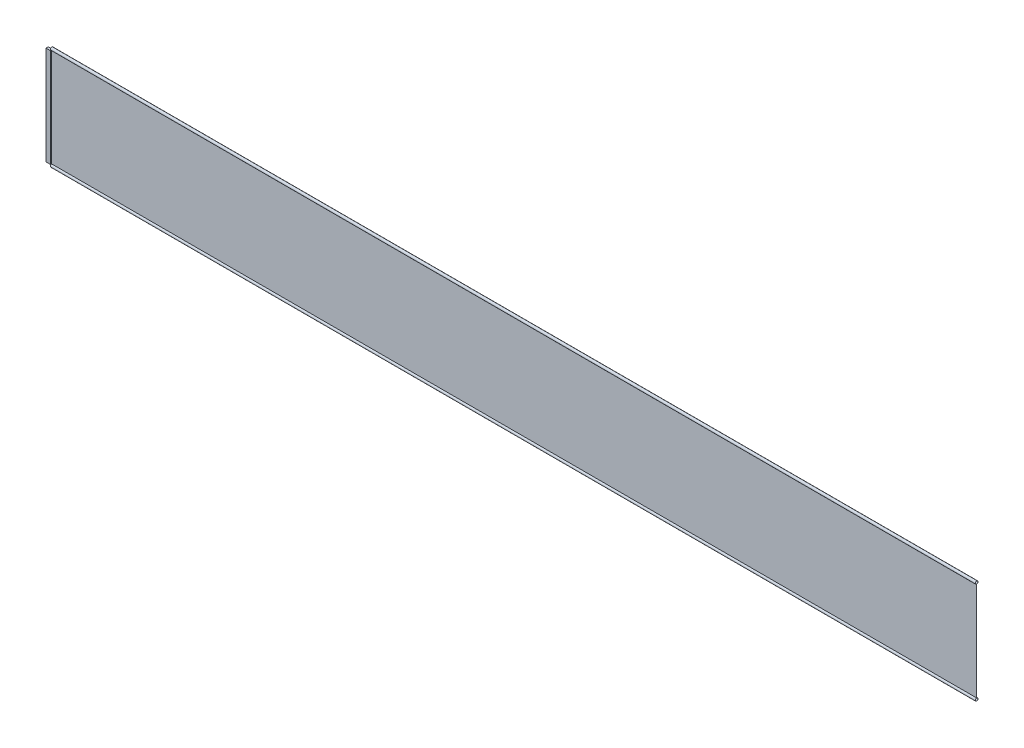
ISO-10303-21;
HEADER;
FILE_DESCRIPTION(('STEP AP214'),'2;1');
FILE_NAME('part.step','',(''),(''),'','','');
FILE_SCHEMA(('AUTOMOTIVE_DESIGN { 1 0 10303 214 1 1 1 1 }'));
ENDSEC;
DATA;
#1=APPLICATION_CONTEXT('core data for automotive mechanical design processes');
#2=APPLICATION_PROTOCOL_DEFINITION('international standard','automotive_design',2000,#1);
#3=PRODUCT_CONTEXT('',#1,'mechanical');
#4=PRODUCT('Part','Part','',(#3));
#5=PRODUCT_RELATED_PRODUCT_CATEGORY('part','',(#4));
#6=PRODUCT_DEFINITION_FORMATION('','',#4);
#7=PRODUCT_DEFINITION_CONTEXT('part definition',#1,'design');
#8=PRODUCT_DEFINITION('design','',#6,#7);
#9=PRODUCT_DEFINITION_SHAPE('','',#8);
#10=(LENGTH_UNIT() NAMED_UNIT(*) SI_UNIT(.MILLI.,.METRE.));
#11=(NAMED_UNIT(*) PLANE_ANGLE_UNIT() SI_UNIT($,.RADIAN.));
#12=(NAMED_UNIT(*) SI_UNIT($,.STERADIAN.) SOLID_ANGLE_UNIT());
#13=UNCERTAINTY_MEASURE_WITH_UNIT(LENGTH_MEASURE(1.E-05),#10,'distance_accuracy_value','');
#14=(GEOMETRIC_REPRESENTATION_CONTEXT(3) GLOBAL_UNCERTAINTY_ASSIGNED_CONTEXT((#13)) GLOBAL_UNIT_ASSIGNED_CONTEXT((#10,
#11,#12)) REPRESENTATION_CONTEXT('',''));
#15=CARTESIAN_POINT('',(0.,0.,0.));
#16=DIRECTION('',(0.,0.,1.));
#17=DIRECTION('',(1.,0.,0.));
#18=AXIS2_PLACEMENT_3D('',#15,#16,#17);
#19=CARTESIAN_POINT('',(43749.6261893495,2210.,0.));
#20=DIRECTION('',(1.,0.,0.));
#21=DIRECTION('',(0.,0.,-1.));
#22=AXIS2_PLACEMENT_3D('',#19,#20,#21);
#23=PLANE('',#22);
#24=CARTESIAN_POINT('',(43749.6261893495,2210.,0.));
#25=DIRECTION('',(1.,0.,0.));
#26=DIRECTION('',(0.,0.,-1.));
#27=AXIS2_PLACEMENT_3D('',#24,#25,#26);
#28=CIRCLE('',#27,60.);
#29=CARTESIAN_POINT('',(43749.6261893495,2210.,-60.));
#30=VERTEX_POINT('',#29);
#31=EDGE_CURVE('E11',#30,#30,#28,.T.);
#32=ORIENTED_EDGE('',*,*,#31,.T.);
#33=EDGE_LOOP('',(#32));
#34=FACE_BOUND('',#33,.T.);
#35=CARTESIAN_POINT('',(43749.6261893495,2210.,0.));
#36=DIRECTION('',(1.,0.,0.));
#37=DIRECTION('',(0.,0.,-1.));
#38=AXIS2_PLACEMENT_3D('',#35,#36,#37);
#39=CIRCLE('',#38,57.);
#40=CARTESIAN_POINT('',(43749.6261893495,2210.,-57.));
#41=VERTEX_POINT('',#40);
#42=EDGE_CURVE('E60',#41,#41,#39,.T.);
#43=ORIENTED_EDGE('',*,*,#42,.F.);
#44=EDGE_LOOP('',(#43));
#45=FACE_BOUND('',#44,.T.);
#46=ADVANCED_FACE('F46',(#34,#45),#23,.T.);
#47=CARTESIAN_POINT('',(3400.,2210.,0.));
#48=DIRECTION('',(1.,0.,0.));
#49=DIRECTION('',(0.,0.,-1.));
#50=AXIS2_PLACEMENT_3D('',#47,#48,#49);
#51=PLANE('',#50);
#52=CARTESIAN_POINT('',(3400.,2210.,0.));
#53=DIRECTION('',(1.,0.,0.));
#54=DIRECTION('',(0.,0.,-1.));
#55=AXIS2_PLACEMENT_3D('',#52,#53,#54);
#56=CIRCLE('',#55,60.);
#57=CARTESIAN_POINT('',(3400.,2210.,-60.));
#58=VERTEX_POINT('',#57);
#59=EDGE_CURVE('E49',#58,#58,#56,.T.);
#60=ORIENTED_EDGE('',*,*,#59,.F.);
#61=EDGE_LOOP('',(#60));
#62=FACE_BOUND('',#61,.T.);
#63=CARTESIAN_POINT('',(3400.,2210.,0.));
#64=DIRECTION('',(1.,0.,0.));
#65=DIRECTION('',(0.,0.,-1.));
#66=AXIS2_PLACEMENT_3D('',#63,#64,#65);
#67=CIRCLE('',#66,57.);
#68=CARTESIAN_POINT('',(3400.,2210.,-57.));
#69=VERTEX_POINT('',#68);
#70=EDGE_CURVE('E56',#69,#69,#67,.T.);
#71=ORIENTED_EDGE('',*,*,#70,.T.);
#72=EDGE_LOOP('',(#71));
#73=FACE_BOUND('',#72,.T.);
#74=ADVANCED_FACE('F66',(#62,#73),#51,.F.);
#75=CARTESIAN_POINT('',(43749.6261893495,2210.,0.));
#76=DIRECTION('',(-1.,0.,0.));
#77=DIRECTION('',(0.,0.,1.));
#78=AXIS2_PLACEMENT_3D('',#75,#76,#77);
#79=CYLINDRICAL_SURFACE('',#78,60.);
#80=ORIENTED_EDGE('',*,*,#31,.F.);
#81=EDGE_LOOP('',(#80));
#82=FACE_BOUND('',#81,.T.);
#83=ORIENTED_EDGE('',*,*,#59,.T.);
#84=EDGE_LOOP('',(#83));
#85=FACE_BOUND('',#84,.T.);
#86=ADVANCED_FACE('F48',(#82,#85),#79,.T.);
#87=CARTESIAN_POINT('',(43749.6261893495,2210.,0.));
#88=DIRECTION('',(-1.,0.,0.));
#89=DIRECTION('',(0.,0.,1.));
#90=AXIS2_PLACEMENT_3D('',#87,#88,#89);
#91=CYLINDRICAL_SURFACE('',#90,57.);
#92=ORIENTED_EDGE('',*,*,#42,.T.);
#93=EDGE_LOOP('',(#92));
#94=FACE_BOUND('',#93,.T.);
#95=ORIENTED_EDGE('',*,*,#70,.F.);
#96=EDGE_LOOP('',(#95));
#97=FACE_BOUND('',#96,.T.);
#98=ADVANCED_FACE('F61',(#94,#97),#91,.F.);
#99=CLOSED_SHELL('',(#46,#74,#86,#98));
#100=MANIFOLD_SOLID_BREP('B2',#99);
#101=CARTESIAN_POINT('',(43749.6261893495,-2210.,0.));
#102=DIRECTION('',(1.,0.,0.));
#103=DIRECTION('',(0.,0.,-1.));
#104=AXIS2_PLACEMENT_3D('',#101,#102,#103);
#105=PLANE('',#104);
#106=CARTESIAN_POINT('',(43749.6261893495,-2210.,0.));
#107=DIRECTION('',(1.,0.,0.));
#108=DIRECTION('',(0.,0.,-1.));
#109=AXIS2_PLACEMENT_3D('',#106,#107,#108);
#110=CIRCLE('',#109,60.);
#111=CARTESIAN_POINT('',(43749.6261893495,-2210.,-60.));
#112=VERTEX_POINT('',#111);
#113=EDGE_CURVE('E44',#112,#112,#110,.T.);
#114=ORIENTED_EDGE('',*,*,#113,.T.);
#115=EDGE_LOOP('',(#114));
#116=FACE_BOUND('',#115,.T.);
#117=CARTESIAN_POINT('',(43749.6261893495,-2210.,0.));
#118=DIRECTION('',(1.,0.,0.));
#119=DIRECTION('',(0.,0.,-1.));
#120=AXIS2_PLACEMENT_3D('',#117,#118,#119);
#121=CIRCLE('',#120,57.);
#122=CARTESIAN_POINT('',(43749.6261893495,-2210.,-57.));
#123=VERTEX_POINT('',#122);
#124=EDGE_CURVE('E126',#123,#123,#121,.T.);
#125=ORIENTED_EDGE('',*,*,#124,.F.);
#126=EDGE_LOOP('',(#125));
#127=FACE_BOUND('',#126,.T.);
#128=ADVANCED_FACE('F119',(#116,#127),#105,.T.);
#129=CARTESIAN_POINT('',(3400.,-2210.,0.));
#130=DIRECTION('',(1.,0.,0.));
#131=DIRECTION('',(0.,0.,-1.));
#132=AXIS2_PLACEMENT_3D('',#129,#130,#131);
#133=PLANE('',#132);
#134=CARTESIAN_POINT('',(3400.,-2210.,0.));
#135=DIRECTION('',(1.,0.,0.));
#136=DIRECTION('',(0.,0.,-1.));
#137=AXIS2_PLACEMENT_3D('',#134,#135,#136);
#138=CIRCLE('',#137,60.);
#139=CARTESIAN_POINT('',(3400.,-2210.,-60.));
#140=VERTEX_POINT('',#139);
#141=EDGE_CURVE('E122',#140,#140,#138,.T.);
#142=ORIENTED_EDGE('',*,*,#141,.F.);
#143=EDGE_LOOP('',(#142));
#144=FACE_BOUND('',#143,.T.);
#145=CARTESIAN_POINT('',(3400.,-2210.,0.));
#146=DIRECTION('',(1.,0.,0.));
#147=DIRECTION('',(0.,0.,-1.));
#148=AXIS2_PLACEMENT_3D('',#145,#146,#147);
#149=CIRCLE('',#148,57.);
#150=CARTESIAN_POINT('',(3400.,-2210.,-57.));
#151=VERTEX_POINT('',#150);
#152=EDGE_CURVE('E128',#151,#151,#149,.T.);
#153=ORIENTED_EDGE('',*,*,#152,.T.);
#154=EDGE_LOOP('',(#153));
#155=FACE_BOUND('',#154,.T.);
#156=ADVANCED_FACE('F138',(#144,#155),#133,.F.);
#157=CARTESIAN_POINT('',(43749.6261893495,-2210.,0.));
#158=DIRECTION('',(-1.,0.,0.));
#159=DIRECTION('',(0.,0.,1.));
#160=AXIS2_PLACEMENT_3D('',#157,#158,#159);
#161=CYLINDRICAL_SURFACE('',#160,60.);
#162=ORIENTED_EDGE('',*,*,#113,.F.);
#163=EDGE_LOOP('',(#162));
#164=FACE_BOUND('',#163,.T.);
#165=ORIENTED_EDGE('',*,*,#141,.T.);
#166=EDGE_LOOP('',(#165));
#167=FACE_BOUND('',#166,.T.);
#168=ADVANCED_FACE('F120',(#164,#167),#161,.T.);
#169=CARTESIAN_POINT('',(43749.6261893495,-2210.,0.));
#170=DIRECTION('',(-1.,0.,0.));
#171=DIRECTION('',(0.,0.,1.));
#172=AXIS2_PLACEMENT_3D('',#169,#170,#171);
#173=CYLINDRICAL_SURFACE('',#172,57.);
#174=ORIENTED_EDGE('',*,*,#124,.T.);
#175=EDGE_LOOP('',(#174));
#176=FACE_BOUND('',#175,.T.);
#177=ORIENTED_EDGE('',*,*,#152,.F.);
#178=EDGE_LOOP('',(#177));
#179=FACE_BOUND('',#178,.T.);
#180=ADVANCED_FACE('F137',(#176,#179),#173,.F.);
#181=CLOSED_SHELL('',(#128,#156,#168,#180));
#182=MANIFOLD_SOLID_BREP('B6',#181);
#183=CARTESIAN_POINT('',(3400.,-2150.,50.));
#184=DIRECTION('',(-1.,0.,0.));
#185=DIRECTION('',(0.,0.,1.));
#186=AXIS2_PLACEMENT_3D('',#183,#184,#185);
#187=PLANE('',#186);
#188=DIRECTION('',(0.,-1.,0.));
#189=VECTOR('',#188,1.);
#190=CARTESIAN_POINT('',(3400.,-2150.,1.5));
#191=LINE('',#190,#189);
#192=CARTESIAN_POINT('',(3400.,2150.,1.5));
#193=VERTEX_POINT('',#192);
#194=CARTESIAN_POINT('',(3400.,-2150.,1.5));
#195=VERTEX_POINT('',#194);
#196=EDGE_CURVE('E247',#193,#195,#191,.T.);
#197=ORIENTED_EDGE('',*,*,#196,.F.);
#198=DIRECTION('',(0.,0.,-1.));
#199=VECTOR('',#198,1.);
#200=CARTESIAN_POINT('',(3400.,2150.,50.));
#201=LINE('',#200,#199);
#202=CARTESIAN_POINT('',(3400.,2150.,50.));
#203=VERTEX_POINT('',#202);
#204=EDGE_CURVE('E296',#203,#193,#201,.T.);
#205=ORIENTED_EDGE('',*,*,#204,.F.);
#206=DIRECTION('',(0.,1.,0.));
#207=VECTOR('',#206,1.);
#208=CARTESIAN_POINT('',(3400.,-2150.,50.));
#209=LINE('',#208,#207);
#210=CARTESIAN_POINT('',(3400.,-2150.,50.));
#211=VERTEX_POINT('',#210);
#212=EDGE_CURVE('E250',#211,#203,#209,.T.);
#213=ORIENTED_EDGE('',*,*,#212,.F.);
#214=DIRECTION('',(0.,0.,-1.));
#215=VECTOR('',#214,1.);
#216=CARTESIAN_POINT('',(3400.,-2150.,50.));
#217=LINE('',#216,#215);
#218=EDGE_CURVE('E189',#211,#195,#217,.T.);
#219=ORIENTED_EDGE('',*,*,#218,.T.);
#220=EDGE_LOOP('',(#197,#205,#213,#219));
#221=FACE_BOUND('',#220,.T.);
#222=ADVANCED_FACE('F176',(#221),#187,.F.);
#223=CARTESIAN_POINT('',(3200.,-2150.,50.));
#224=DIRECTION('',(1.,0.,0.));
#225=DIRECTION('',(0.,0.,-1.));
#226=AXIS2_PLACEMENT_3D('',#223,#224,#225);
#227=PLANE('',#226);
#228=DIRECTION('',(0.,-1.,0.));
#229=VECTOR('',#228,1.);
#230=CARTESIAN_POINT('',(3200.,-2150.,-50.));
#231=LINE('',#230,#229);
#232=CARTESIAN_POINT('',(3200.,2150.,-50.));
#233=VERTEX_POINT('',#232);
#234=CARTESIAN_POINT('',(3200.,-2150.,-50.));
#235=VERTEX_POINT('',#234);
#236=EDGE_CURVE('E276',#233,#235,#231,.T.);
#237=ORIENTED_EDGE('',*,*,#236,.T.);
#238=DIRECTION('',(0.,0.,-1.));
#239=VECTOR('',#238,1.);
#240=CARTESIAN_POINT('',(3200.,-2150.,50.));
#241=LINE('',#240,#239);
#242=CARTESIAN_POINT('',(3200.,-2150.,50.));
#243=VERTEX_POINT('',#242);
#244=EDGE_CURVE('E113',#243,#235,#241,.T.);
#245=ORIENTED_EDGE('',*,*,#244,.F.);
#246=DIRECTION('',(0.,-1.,0.));
#247=VECTOR('',#246,1.);
#248=CARTESIAN_POINT('',(3200.,-2150.,50.));
#249=LINE('',#248,#247);
#250=CARTESIAN_POINT('',(3200.,2150.,50.));
#251=VERTEX_POINT('',#250);
#252=EDGE_CURVE('E278',#251,#243,#249,.T.);
#253=ORIENTED_EDGE('',*,*,#252,.F.);
#254=DIRECTION('',(0.,0.,-1.));
#255=VECTOR('',#254,1.);
#256=CARTESIAN_POINT('',(3200.,2150.,50.));
#257=LINE('',#256,#255);
#258=EDGE_CURVE('E286',#251,#233,#257,.T.);
#259=ORIENTED_EDGE('',*,*,#258,.T.);
#260=EDGE_LOOP('',(#237,#245,#253,#259));
#261=FACE_BOUND('',#260,.T.);
#262=ADVANCED_FACE('F182',(#261),#227,.F.);
#263=CARTESIAN_POINT('',(3200.,-2150.,50.));
#264=DIRECTION('',(0.,1.,0.));
#265=DIRECTION('',(0.,0.,1.));
#266=AXIS2_PLACEMENT_3D('',#263,#264,#265);
#267=PLANE('',#266);
#268=DIRECTION('',(1.,0.,0.));
#269=VECTOR('',#268,1.);
#270=CARTESIAN_POINT('',(3400.,-2150.,-1.5));
#271=LINE('',#270,#269);
#272=CARTESIAN_POINT('',(3400.,-2150.,-1.5));
#273=VERTEX_POINT('',#272);
#274=CARTESIAN_POINT('',(43749.6261893495,-2150.,-1.5));
#275=VERTEX_POINT('',#274);
#276=EDGE_CURVE('E272',#273,#275,#271,.T.);
#277=ORIENTED_EDGE('',*,*,#276,.T.);
#278=DIRECTION('',(0.,0.,-1.));
#279=VECTOR('',#278,1.);
#280=CARTESIAN_POINT('',(43749.6261893495,-2150.,1.5));
#281=LINE('',#280,#279);
#282=CARTESIAN_POINT('',(43749.6261893495,-2150.,1.5));
#283=VERTEX_POINT('',#282);
#284=EDGE_CURVE('E254',#283,#275,#281,.T.);
#285=ORIENTED_EDGE('',*,*,#284,.F.);
#286=DIRECTION('',(1.,0.,0.));
#287=VECTOR('',#286,1.);
#288=CARTESIAN_POINT('',(3400.,-2150.,1.5));
#289=LINE('',#288,#287);
#290=EDGE_CURVE('E252',#195,#283,#289,.T.);
#291=ORIENTED_EDGE('',*,*,#290,.F.);
#292=ORIENTED_EDGE('',*,*,#218,.F.);
#293=DIRECTION('',(1.,0.,0.));
#294=VECTOR('',#293,1.);
#295=CARTESIAN_POINT('',(3200.,-2150.,50.));
#296=LINE('',#295,#294);
#297=EDGE_CURVE('E282',#243,#211,#296,.T.);
#298=ORIENTED_EDGE('',*,*,#297,.F.);
#299=ORIENTED_EDGE('',*,*,#244,.T.);
#300=DIRECTION('',(1.,0.,0.));
#301=VECTOR('',#300,1.);
#302=CARTESIAN_POINT('',(3200.,-2150.,-50.));
#303=LINE('',#302,#301);
#304=CARTESIAN_POINT('',(3400.,-2150.,-50.));
#305=VERTEX_POINT('',#304);
#306=EDGE_CURVE('E295',#235,#305,#303,.T.);
#307=ORIENTED_EDGE('',*,*,#306,.T.);
#308=EDGE_CURVE('E248',#273,#305,#217,.T.);
#309=ORIENTED_EDGE('',*,*,#308,.F.);
#310=EDGE_LOOP('',(#277,#285,#291,#292,#298,#299,#307,#309));
#311=FACE_BOUND('',#310,.T.);
#312=ADVANCED_FACE('F255',(#311),#267,.F.);
#313=CARTESIAN_POINT('',(3400.,2150.,-1.5));
#314=VERTEX_POINT('',#313);
#315=CARTESIAN_POINT('',(3400.,2150.,-50.));
#316=VERTEX_POINT('',#315);
#317=EDGE_CURVE('E200',#314,#316,#201,.T.);
#318=ORIENTED_EDGE('',*,*,#317,.F.);
#319=DIRECTION('',(0.,-1.,0.));
#320=VECTOR('',#319,1.);
#321=CARTESIAN_POINT('',(3400.,-2150.,-1.5));
#322=LINE('',#321,#320);
#323=EDGE_CURVE('E191',#314,#273,#322,.T.);
#324=ORIENTED_EDGE('',*,*,#323,.T.);
#325=ORIENTED_EDGE('',*,*,#308,.T.);
#326=DIRECTION('',(0.,1.,0.));
#327=VECTOR('',#326,1.);
#328=CARTESIAN_POINT('',(3400.,-2150.,-50.));
#329=LINE('',#328,#327);
#330=EDGE_CURVE('E293',#305,#316,#329,.T.);
#331=ORIENTED_EDGE('',*,*,#330,.T.);
#332=EDGE_LOOP('',(#318,#324,#325,#331));
#333=FACE_BOUND('',#332,.T.);
#334=ADVANCED_FACE('F306',(#333),#187,.F.);
#335=CARTESIAN_POINT('',(3200.,2150.,50.));
#336=DIRECTION('',(0.,-1.,0.));
#337=DIRECTION('',(0.,0.,-1.));
#338=AXIS2_PLACEMENT_3D('',#335,#336,#337);
#339=PLANE('',#338);
#340=DIRECTION('',(0.,0.,-1.));
#341=VECTOR('',#340,1.);
#342=CARTESIAN_POINT('',(43749.6261893495,2150.,1.5));
#343=LINE('',#342,#341);
#344=CARTESIAN_POINT('',(43749.6261893495,2150.,1.5));
#345=VERTEX_POINT('',#344);
#346=CARTESIAN_POINT('',(43749.6261893495,2150.,-1.5));
#347=VERTEX_POINT('',#346);
#348=EDGE_CURVE('E271',#345,#347,#343,.T.);
#349=ORIENTED_EDGE('',*,*,#348,.T.);
#350=DIRECTION('',(-1.,0.,0.));
#351=VECTOR('',#350,1.);
#352=CARTESIAN_POINT('',(3400.,2150.,-1.5));
#353=LINE('',#352,#351);
#354=EDGE_CURVE('E262',#347,#314,#353,.T.);
#355=ORIENTED_EDGE('',*,*,#354,.T.);
#356=ORIENTED_EDGE('',*,*,#317,.T.);
#357=DIRECTION('',(-1.,0.,0.));
#358=VECTOR('',#357,1.);
#359=CARTESIAN_POINT('',(3200.,2150.,-50.));
#360=LINE('',#359,#358);
#361=EDGE_CURVE('E285',#316,#233,#360,.T.);
#362=ORIENTED_EDGE('',*,*,#361,.T.);
#363=ORIENTED_EDGE('',*,*,#258,.F.);
#364=DIRECTION('',(-1.,0.,0.));
#365=VECTOR('',#364,1.);
#366=CARTESIAN_POINT('',(3200.,2150.,50.));
#367=LINE('',#366,#365);
#368=EDGE_CURVE('E289',#203,#251,#367,.T.);
#369=ORIENTED_EDGE('',*,*,#368,.F.);
#370=ORIENTED_EDGE('',*,*,#204,.T.);
#371=DIRECTION('',(-1.,0.,0.));
#372=VECTOR('',#371,1.);
#373=CARTESIAN_POINT('',(3400.,2150.,1.5));
#374=LINE('',#373,#372);
#375=EDGE_CURVE('E263',#345,#193,#374,.T.);
#376=ORIENTED_EDGE('',*,*,#375,.F.);
#377=EDGE_LOOP('',(#349,#355,#356,#362,#363,#369,#370,#376));
#378=FACE_BOUND('',#377,.T.);
#379=ADVANCED_FACE('F305',(#378),#339,.F.);
#380=CARTESIAN_POINT('',(0.,0.,50.));
#381=DIRECTION('',(0.,0.,-1.));
#382=DIRECTION('',(-1.,0.,0.));
#383=AXIS2_PLACEMENT_3D('',#380,#381,#382);
#384=PLANE('',#383);
#385=ORIENTED_EDGE('',*,*,#252,.T.);
#386=ORIENTED_EDGE('',*,*,#297,.T.);
#387=ORIENTED_EDGE('',*,*,#212,.T.);
#388=ORIENTED_EDGE('',*,*,#368,.T.);
#389=EDGE_LOOP('',(#385,#386,#387,#388));
#390=FACE_BOUND('',#389,.T.);
#391=ADVANCED_FACE('F316',(#390),#384,.F.);
#392=CARTESIAN_POINT('',(0.,0.,-50.));
#393=DIRECTION('',(0.,0.,-1.));
#394=DIRECTION('',(-1.,0.,0.));
#395=AXIS2_PLACEMENT_3D('',#392,#393,#394);
#396=PLANE('',#395);
#397=ORIENTED_EDGE('',*,*,#236,.F.);
#398=ORIENTED_EDGE('',*,*,#361,.F.);
#399=ORIENTED_EDGE('',*,*,#330,.F.);
#400=ORIENTED_EDGE('',*,*,#306,.F.);
#401=EDGE_LOOP('',(#397,#398,#399,#400));
#402=FACE_BOUND('',#401,.T.);
#403=ADVANCED_FACE('F313',(#402),#396,.T.);
#404=CARTESIAN_POINT('',(43749.6261893495,-2150.,1.5));
#405=DIRECTION('',(-1.,0.,0.));
#406=DIRECTION('',(0.,0.,1.));
#407=AXIS2_PLACEMENT_3D('',#404,#405,#406);
#408=PLANE('',#407);
#409=DIRECTION('',(0.,1.,0.));
#410=VECTOR('',#409,1.);
#411=CARTESIAN_POINT('',(43749.6261893495,-2150.,-1.5));
#412=LINE('',#411,#410);
#413=EDGE_CURVE('E266',#275,#347,#412,.T.);
#414=ORIENTED_EDGE('',*,*,#413,.T.);
#415=ORIENTED_EDGE('',*,*,#348,.F.);
#416=DIRECTION('',(0.,1.,0.));
#417=VECTOR('',#416,1.);
#418=CARTESIAN_POINT('',(43749.6261893495,-2150.,1.5));
#419=LINE('',#418,#417);
#420=EDGE_CURVE('E256',#283,#345,#419,.T.);
#421=ORIENTED_EDGE('',*,*,#420,.F.);
#422=ORIENTED_EDGE('',*,*,#284,.T.);
#423=EDGE_LOOP('',(#414,#415,#421,#422));
#424=FACE_BOUND('',#423,.T.);
#425=ADVANCED_FACE('F323',(#424),#408,.F.);
#426=CARTESIAN_POINT('',(0.,0.,1.5));
#427=DIRECTION('',(0.,0.,-1.));
#428=DIRECTION('',(-1.,0.,0.));
#429=AXIS2_PLACEMENT_3D('',#426,#427,#428);
#430=PLANE('',#429);
#431=ORIENTED_EDGE('',*,*,#196,.T.);
#432=ORIENTED_EDGE('',*,*,#290,.T.);
#433=ORIENTED_EDGE('',*,*,#420,.T.);
#434=ORIENTED_EDGE('',*,*,#375,.T.);
#435=EDGE_LOOP('',(#431,#432,#433,#434));
#436=FACE_BOUND('',#435,.T.);
#437=ADVANCED_FACE('F261',(#436),#430,.F.);
#438=CARTESIAN_POINT('',(0.,0.,-1.5));
#439=DIRECTION('',(0.,0.,-1.));
#440=DIRECTION('',(-1.,0.,0.));
#441=AXIS2_PLACEMENT_3D('',#438,#439,#440);
#442=PLANE('',#441);
#443=ORIENTED_EDGE('',*,*,#323,.F.);
#444=ORIENTED_EDGE('',*,*,#354,.F.);
#445=ORIENTED_EDGE('',*,*,#413,.F.);
#446=ORIENTED_EDGE('',*,*,#276,.F.);
#447=EDGE_LOOP('',(#443,#444,#445,#446));
#448=FACE_BOUND('',#447,.T.);
#449=ADVANCED_FACE('F319',(#448),#442,.T.);
#450=CLOSED_SHELL('',(#222,#262,#312,#334,#379,#391,#403,#425,#437,#449));
#451=MANIFOLD_SOLID_BREP('B37',#450);
#452=ADVANCED_BREP_SHAPE_REPRESENTATION('',(#18,#100,#182,#451),#14);
#453=SHAPE_DEFINITION_REPRESENTATION(#9,#452);
ENDSEC;
END-ISO-10303-21;
